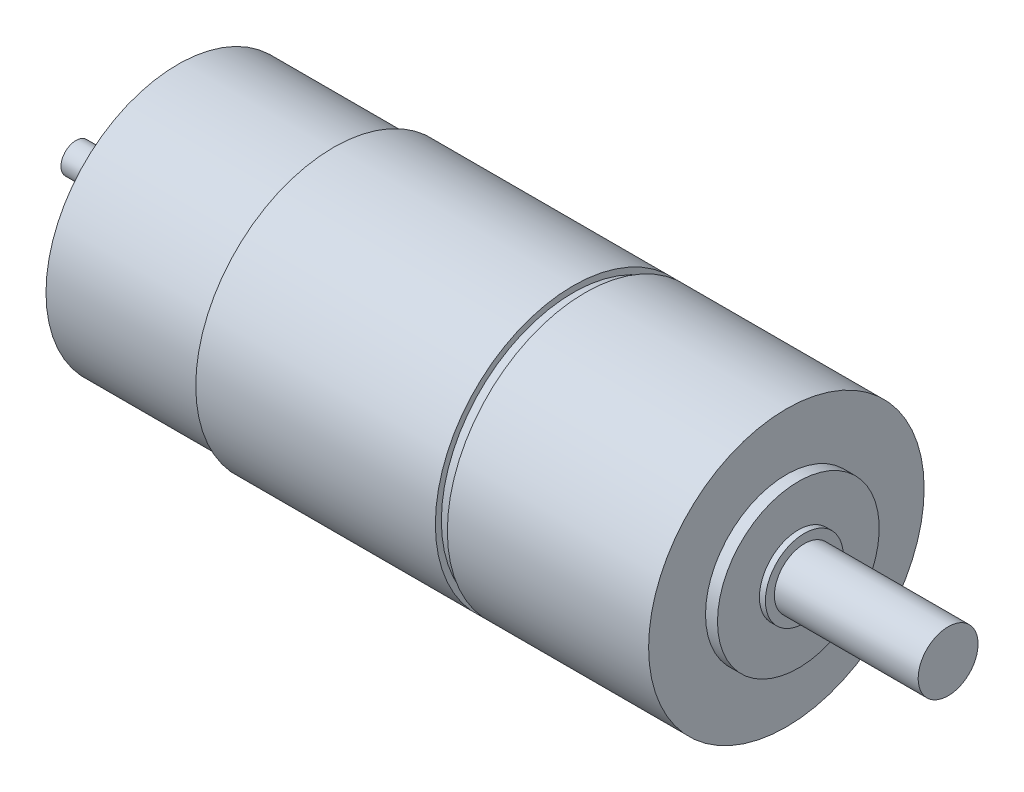
ISO-10303-21;
HEADER;
FILE_DESCRIPTION(('STEP AP214'),'2;1');
FILE_NAME('part.step','',(''),(''),'','','');
FILE_SCHEMA(('AUTOMOTIVE_DESIGN { 1 0 10303 214 1 1 1 1 }'));
ENDSEC;
DATA;
#1=APPLICATION_CONTEXT('core data for automotive mechanical design processes');
#2=APPLICATION_PROTOCOL_DEFINITION('international standard','automotive_design',2000,#1);
#3=PRODUCT_CONTEXT('',#1,'mechanical');
#4=PRODUCT('Part','Part','',(#3));
#5=PRODUCT_RELATED_PRODUCT_CATEGORY('part','',(#4));
#6=PRODUCT_DEFINITION_FORMATION('','',#4);
#7=PRODUCT_DEFINITION_CONTEXT('part definition',#1,'design');
#8=PRODUCT_DEFINITION('design','',#6,#7);
#9=PRODUCT_DEFINITION_SHAPE('','',#8);
#10=(LENGTH_UNIT() NAMED_UNIT(*) SI_UNIT(.MILLI.,.METRE.));
#11=(NAMED_UNIT(*) PLANE_ANGLE_UNIT() SI_UNIT($,.RADIAN.));
#12=(NAMED_UNIT(*) SI_UNIT($,.STERADIAN.) SOLID_ANGLE_UNIT());
#13=UNCERTAINTY_MEASURE_WITH_UNIT(LENGTH_MEASURE(1.E-05),#10,'distance_accuracy_value','');
#14=(GEOMETRIC_REPRESENTATION_CONTEXT(3) GLOBAL_UNCERTAINTY_ASSIGNED_CONTEXT((#13)) GLOBAL_UNIT_ASSIGNED_CONTEXT((#10,
#11,#12)) REPRESENTATION_CONTEXT('',''));
#15=CARTESIAN_POINT('',(0.,0.,0.));
#16=DIRECTION('',(0.,0.,1.));
#17=DIRECTION('',(1.,0.,0.));
#18=AXIS2_PLACEMENT_3D('',#15,#16,#17);
#19=CARTESIAN_POINT('',(145.6,0.,0.));
#20=DIRECTION('',(1.,0.,0.));
#21=DIRECTION('',(0.,0.,-1.));
#22=AXIS2_PLACEMENT_3D('',#19,#20,#21);
#23=PLANE('',#22);
#24=CARTESIAN_POINT('',(145.6,0.,0.));
#25=DIRECTION('',(-1.,0.,0.));
#26=DIRECTION('',(0.,0.,1.));
#27=AXIS2_PLACEMENT_3D('',#24,#25,#26);
#28=CIRCLE('',#27,5.);
#29=CARTESIAN_POINT('',(145.6,0.,5.));
#30=VERTEX_POINT('',#29);
#31=EDGE_CURVE('E49',#30,#30,#28,.T.);
#32=ORIENTED_EDGE('',*,*,#31,.F.);
#33=EDGE_LOOP('',(#32));
#34=FACE_BOUND('',#33,.T.);
#35=ADVANCED_FACE('F40',(#34),#23,.T.);
#36=CARTESIAN_POINT('',(0.,0.,0.));
#37=DIRECTION('',(-1.,0.,0.));
#38=DIRECTION('',(0.,0.,1.));
#39=AXIS2_PLACEMENT_3D('',#36,#37,#38);
#40=CYLINDRICAL_SURFACE('',#39,5.);
#41=ORIENTED_EDGE('',*,*,#31,.T.);
#42=EDGE_LOOP('',(#41));
#43=FACE_BOUND('',#42,.T.);
#44=CARTESIAN_POINT('',(121.6,0.,0.));
#45=DIRECTION('',(-1.,0.,0.));
#46=DIRECTION('',(0.,0.,1.));
#47=AXIS2_PLACEMENT_3D('',#44,#45,#46);
#48=CIRCLE('',#47,5.);
#49=CARTESIAN_POINT('',(121.6,0.,5.));
#50=VERTEX_POINT('',#49);
#51=EDGE_CURVE('E54',#50,#50,#48,.T.);
#52=ORIENTED_EDGE('',*,*,#51,.F.);
#53=EDGE_LOOP('',(#52));
#54=FACE_BOUND('',#53,.T.);
#55=ADVANCED_FACE('F348',(#43,#54),#40,.T.);
#56=CARTESIAN_POINT('',(121.6,0.,0.));
#57=DIRECTION('',(1.,0.,0.));
#58=DIRECTION('',(0.,0.,-1.));
#59=AXIS2_PLACEMENT_3D('',#56,#57,#58);
#60=PLANE('',#59);
#61=ORIENTED_EDGE('',*,*,#51,.T.);
#62=EDGE_LOOP('',(#61));
#63=FACE_BOUND('',#62,.T.);
#64=CARTESIAN_POINT('',(121.6,0.,0.));
#65=DIRECTION('',(-1.,0.,0.));
#66=DIRECTION('',(0.,0.,1.));
#67=AXIS2_PLACEMENT_3D('',#64,#65,#66);
#68=CIRCLE('',#67,6.5);
#69=CARTESIAN_POINT('',(121.6,0.,6.5));
#70=VERTEX_POINT('',#69);
#71=EDGE_CURVE('E59',#70,#70,#68,.T.);
#72=ORIENTED_EDGE('',*,*,#71,.F.);
#73=EDGE_LOOP('',(#72));
#74=FACE_BOUND('',#73,.T.);
#75=ADVANCED_FACE('F338',(#63,#74),#60,.T.);
#76=CARTESIAN_POINT('',(0.,0.,0.));
#77=DIRECTION('',(-1.,0.,0.));
#78=DIRECTION('',(0.,0.,1.));
#79=AXIS2_PLACEMENT_3D('',#76,#77,#78);
#80=CYLINDRICAL_SURFACE('',#79,6.5);
#81=ORIENTED_EDGE('',*,*,#71,.T.);
#82=EDGE_LOOP('',(#81));
#83=FACE_BOUND('',#82,.T.);
#84=CARTESIAN_POINT('',(120.6,0.,0.));
#85=DIRECTION('',(-1.,0.,0.));
#86=DIRECTION('',(0.,0.,1.));
#87=AXIS2_PLACEMENT_3D('',#84,#85,#86);
#88=CIRCLE('',#87,6.5);
#89=CARTESIAN_POINT('',(120.6,0.,6.5));
#90=VERTEX_POINT('',#89);
#91=EDGE_CURVE('E65',#90,#90,#88,.T.);
#92=ORIENTED_EDGE('',*,*,#91,.F.);
#93=EDGE_LOOP('',(#92));
#94=FACE_BOUND('',#93,.T.);
#95=ADVANCED_FACE('F328',(#83,#94),#80,.T.);
#96=CARTESIAN_POINT('',(120.6,0.,0.));
#97=DIRECTION('',(1.,0.,0.));
#98=DIRECTION('',(0.,0.,-1.));
#99=AXIS2_PLACEMENT_3D('',#96,#97,#98);
#100=PLANE('',#99);
#101=ORIENTED_EDGE('',*,*,#91,.T.);
#102=EDGE_LOOP('',(#101));
#103=FACE_BOUND('',#102,.T.);
#104=CARTESIAN_POINT('',(120.6,0.,0.));
#105=DIRECTION('',(-1.,0.,0.));
#106=DIRECTION('',(0.,0.,1.));
#107=AXIS2_PLACEMENT_3D('',#104,#105,#106);
#108=CIRCLE('',#107,13.5);
#109=CARTESIAN_POINT('',(120.6,0.,13.5));
#110=VERTEX_POINT('',#109);
#111=EDGE_CURVE('E69',#110,#110,#108,.T.);
#112=ORIENTED_EDGE('',*,*,#111,.F.);
#113=EDGE_LOOP('',(#112));
#114=FACE_BOUND('',#113,.T.);
#115=ADVANCED_FACE('F318',(#103,#114),#100,.T.);
#116=CARTESIAN_POINT('',(0.,0.,0.));
#117=DIRECTION('',(-1.,0.,0.));
#118=DIRECTION('',(0.,0.,1.));
#119=AXIS2_PLACEMENT_3D('',#116,#117,#118);
#120=CYLINDRICAL_SURFACE('',#119,13.5);
#121=ORIENTED_EDGE('',*,*,#111,.T.);
#122=EDGE_LOOP('',(#121));
#123=FACE_BOUND('',#122,.T.);
#124=CARTESIAN_POINT('',(118.6,0.,0.));
#125=DIRECTION('',(-1.,0.,0.));
#126=DIRECTION('',(0.,0.,1.));
#127=AXIS2_PLACEMENT_3D('',#124,#125,#126);
#128=CIRCLE('',#127,13.5);
#129=CARTESIAN_POINT('',(118.6,0.,13.5));
#130=VERTEX_POINT('',#129);
#131=EDGE_CURVE('E73',#130,#130,#128,.T.);
#132=ORIENTED_EDGE('',*,*,#131,.F.);
#133=EDGE_LOOP('',(#132));
#134=FACE_BOUND('',#133,.T.);
#135=ADVANCED_FACE('F308',(#123,#134),#120,.T.);
#136=CARTESIAN_POINT('',(118.6,0.,0.));
#137=DIRECTION('',(1.,0.,0.));
#138=DIRECTION('',(0.,0.,-1.));
#139=AXIS2_PLACEMENT_3D('',#136,#137,#138);
#140=PLANE('',#139);
#141=ORIENTED_EDGE('',*,*,#131,.T.);
#142=EDGE_LOOP('',(#141));
#143=FACE_BOUND('',#142,.T.);
#144=CARTESIAN_POINT('',(118.6,0.,0.));
#145=DIRECTION('',(-1.,0.,0.));
#146=DIRECTION('',(0.,0.,1.));
#147=AXIS2_PLACEMENT_3D('',#144,#145,#146);
#148=CIRCLE('',#147,23.);
#149=CARTESIAN_POINT('',(118.6,0.,23.));
#150=VERTEX_POINT('',#149);
#151=EDGE_CURVE('E77',#150,#150,#148,.T.);
#152=ORIENTED_EDGE('',*,*,#151,.F.);
#153=EDGE_LOOP('',(#152));
#154=FACE_BOUND('',#153,.T.);
#155=ADVANCED_FACE('F298',(#143,#154),#140,.T.);
#156=CARTESIAN_POINT('',(0.,0.,0.));
#157=DIRECTION('',(-1.,0.,0.));
#158=DIRECTION('',(0.,0.,1.));
#159=AXIS2_PLACEMENT_3D('',#156,#157,#158);
#160=CYLINDRICAL_SURFACE('',#159,23.);
#161=ORIENTED_EDGE('',*,*,#151,.T.);
#162=EDGE_LOOP('',(#161));
#163=FACE_BOUND('',#162,.T.);
#164=CARTESIAN_POINT('',(85.,0.,0.));
#165=DIRECTION('',(-1.,0.,0.));
#166=DIRECTION('',(0.,0.,1.));
#167=AXIS2_PLACEMENT_3D('',#164,#165,#166);
#168=CIRCLE('',#167,23.);
#169=CARTESIAN_POINT('',(85.,0.,23.));
#170=VERTEX_POINT('',#169);
#171=EDGE_CURVE('E81',#170,#170,#168,.T.);
#172=ORIENTED_EDGE('',*,*,#171,.F.);
#173=EDGE_LOOP('',(#172));
#174=FACE_BOUND('',#173,.T.);
#175=ADVANCED_FACE('F288',(#163,#174),#160,.T.);
#176=CARTESIAN_POINT('',(85.,0.,0.));
#177=DIRECTION('',(1.,0.,0.));
#178=DIRECTION('',(0.,0.,-1.));
#179=AXIS2_PLACEMENT_3D('',#176,#177,#178);
#180=PLANE('',#179);
#181=CARTESIAN_POINT('',(85.,0.,0.));
#182=DIRECTION('',(-1.,0.,0.));
#183=DIRECTION('',(0.,0.,1.));
#184=AXIS2_PLACEMENT_3D('',#181,#182,#183);
#185=CIRCLE('',#184,22.);
#186=CARTESIAN_POINT('',(85.,0.,22.));
#187=VERTEX_POINT('',#186);
#188=EDGE_CURVE('E85',#187,#187,#185,.T.);
#189=ORIENTED_EDGE('',*,*,#188,.F.);
#190=EDGE_LOOP('',(#189));
#191=FACE_BOUND('',#190,.T.);
#192=ORIENTED_EDGE('',*,*,#171,.T.);
#193=EDGE_LOOP('',(#192));
#194=FACE_BOUND('',#193,.T.);
#195=ADVANCED_FACE('F278',(#191,#194),#180,.F.);
#196=CARTESIAN_POINT('',(0.,0.,0.));
#197=DIRECTION('',(-1.,0.,0.));
#198=DIRECTION('',(0.,0.,1.));
#199=AXIS2_PLACEMENT_3D('',#196,#197,#198);
#200=CYLINDRICAL_SURFACE('',#199,22.);
#201=ORIENTED_EDGE('',*,*,#188,.T.);
#202=EDGE_LOOP('',(#201));
#203=FACE_BOUND('',#202,.T.);
#204=CARTESIAN_POINT('',(83.,0.,0.));
#205=DIRECTION('',(-1.,0.,0.));
#206=DIRECTION('',(0.,0.,1.));
#207=AXIS2_PLACEMENT_3D('',#204,#205,#206);
#208=CIRCLE('',#207,22.);
#209=CARTESIAN_POINT('',(83.,0.,22.));
#210=VERTEX_POINT('',#209);
#211=EDGE_CURVE('E89',#210,#210,#208,.T.);
#212=ORIENTED_EDGE('',*,*,#211,.F.);
#213=EDGE_LOOP('',(#212));
#214=FACE_BOUND('',#213,.T.);
#215=ADVANCED_FACE('F268',(#203,#214),#200,.T.);
#216=CARTESIAN_POINT('',(83.,0.,0.));
#217=DIRECTION('',(1.,0.,0.));
#218=DIRECTION('',(0.,0.,-1.));
#219=AXIS2_PLACEMENT_3D('',#216,#217,#218);
#220=PLANE('',#219);
#221=ORIENTED_EDGE('',*,*,#211,.T.);
#222=EDGE_LOOP('',(#221));
#223=FACE_BOUND('',#222,.T.);
#224=CARTESIAN_POINT('',(83.,0.,0.));
#225=DIRECTION('',(-1.,0.,0.));
#226=DIRECTION('',(0.,0.,1.));
#227=AXIS2_PLACEMENT_3D('',#224,#225,#226);
#228=CIRCLE('',#227,23.);
#229=CARTESIAN_POINT('',(83.,0.,23.));
#230=VERTEX_POINT('',#229);
#231=EDGE_CURVE('E93',#230,#230,#228,.T.);
#232=ORIENTED_EDGE('',*,*,#231,.F.);
#233=EDGE_LOOP('',(#232));
#234=FACE_BOUND('',#233,.T.);
#235=ADVANCED_FACE('F258',(#223,#234),#220,.T.);
#236=CARTESIAN_POINT('',(0.,0.,0.));
#237=DIRECTION('',(-1.,0.,0.));
#238=DIRECTION('',(0.,0.,1.));
#239=AXIS2_PLACEMENT_3D('',#236,#237,#238);
#240=CYLINDRICAL_SURFACE('',#239,23.);
#241=ORIENTED_EDGE('',*,*,#231,.T.);
#242=EDGE_LOOP('',(#241));
#243=FACE_BOUND('',#242,.T.);
#244=CARTESIAN_POINT('',(43.,0.,0.));
#245=DIRECTION('',(-1.,0.,0.));
#246=DIRECTION('',(0.,0.,1.));
#247=AXIS2_PLACEMENT_3D('',#244,#245,#246);
#248=CIRCLE('',#247,23.);
#249=CARTESIAN_POINT('',(43.,0.,23.));
#250=VERTEX_POINT('',#249);
#251=EDGE_CURVE('E97',#250,#250,#248,.T.);
#252=ORIENTED_EDGE('',*,*,#251,.F.);
#253=EDGE_LOOP('',(#252));
#254=FACE_BOUND('',#253,.T.);
#255=ADVANCED_FACE('F248',(#243,#254),#240,.T.);
#256=CARTESIAN_POINT('',(43.,0.,0.));
#257=DIRECTION('',(-1.,0.,0.));
#258=DIRECTION('',(0.,0.,1.));
#259=AXIS2_PLACEMENT_3D('',#256,#257,#258);
#260=PLANE('',#259);
#261=ORIENTED_EDGE('',*,*,#251,.T.);
#262=EDGE_LOOP('',(#261));
#263=FACE_BOUND('',#262,.T.);
#264=CARTESIAN_POINT('',(43.,0.,0.));
#265=DIRECTION('',(-1.,0.,0.));
#266=DIRECTION('',(0.,0.,1.));
#267=AXIS2_PLACEMENT_3D('',#264,#265,#266);
#268=CIRCLE('',#267,22.);
#269=CARTESIAN_POINT('',(43.,0.,22.));
#270=VERTEX_POINT('',#269);
#271=EDGE_CURVE('E101',#270,#270,#268,.T.);
#272=ORIENTED_EDGE('',*,*,#271,.F.);
#273=EDGE_LOOP('',(#272));
#274=FACE_BOUND('',#273,.T.);
#275=ADVANCED_FACE('F236',(#263,#274),#260,.T.);
#276=CARTESIAN_POINT('',(0.,0.,0.));
#277=DIRECTION('',(-1.,0.,0.));
#278=DIRECTION('',(0.,0.,1.));
#279=AXIS2_PLACEMENT_3D('',#276,#277,#278);
#280=CYLINDRICAL_SURFACE('',#279,22.);
#281=ORIENTED_EDGE('',*,*,#271,.T.);
#282=EDGE_LOOP('',(#281));
#283=FACE_BOUND('',#282,.T.);
#284=CARTESIAN_POINT('',(17.,0.,0.));
#285=DIRECTION('',(-1.,0.,0.));
#286=DIRECTION('',(0.,0.,1.));
#287=AXIS2_PLACEMENT_3D('',#284,#285,#286);
#288=CIRCLE('',#287,22.);
#289=CARTESIAN_POINT('',(17.,0.,22.));
#290=VERTEX_POINT('',#289);
#291=EDGE_CURVE('E105',#290,#290,#288,.T.);
#292=ORIENTED_EDGE('',*,*,#291,.F.);
#293=EDGE_LOOP('',(#292));
#294=FACE_BOUND('',#293,.T.);
#295=ADVANCED_FACE('F227',(#283,#294),#280,.T.);
#296=CARTESIAN_POINT('',(17.,0.,0.));
#297=DIRECTION('',(-1.,0.,0.));
#298=DIRECTION('',(0.,0.,1.));
#299=AXIS2_PLACEMENT_3D('',#296,#297,#298);
#300=PLANE('',#299);
#301=ORIENTED_EDGE('',*,*,#291,.T.);
#302=EDGE_LOOP('',(#301));
#303=FACE_BOUND('',#302,.T.);
#304=CARTESIAN_POINT('',(17.,0.,0.));
#305=DIRECTION('',(-1.,0.,0.));
#306=DIRECTION('',(0.,0.,1.));
#307=AXIS2_PLACEMENT_3D('',#304,#305,#306);
#308=CIRCLE('',#307,6.);
#309=CARTESIAN_POINT('',(17.,0.,6.));
#310=VERTEX_POINT('',#309);
#311=EDGE_CURVE('E109',#310,#310,#308,.T.);
#312=ORIENTED_EDGE('',*,*,#311,.F.);
#313=EDGE_LOOP('',(#312));
#314=FACE_BOUND('',#313,.T.);
#315=ADVANCED_FACE('F218',(#303,#314),#300,.T.);
#316=CARTESIAN_POINT('',(0.,0.,0.));
#317=DIRECTION('',(-1.,0.,0.));
#318=DIRECTION('',(0.,0.,1.));
#319=AXIS2_PLACEMENT_3D('',#316,#317,#318);
#320=CYLINDRICAL_SURFACE('',#319,6.);
#321=ORIENTED_EDGE('',*,*,#311,.T.);
#322=EDGE_LOOP('',(#321));
#323=FACE_BOUND('',#322,.T.);
#324=CARTESIAN_POINT('',(12.,0.,0.));
#325=DIRECTION('',(-1.,0.,0.));
#326=DIRECTION('',(0.,0.,1.));
#327=AXIS2_PLACEMENT_3D('',#324,#325,#326);
#328=CIRCLE('',#327,6.);
#329=CARTESIAN_POINT('',(12.,0.,6.));
#330=VERTEX_POINT('',#329);
#331=EDGE_CURVE('E113',#330,#330,#328,.T.);
#332=ORIENTED_EDGE('',*,*,#331,.F.);
#333=EDGE_LOOP('',(#332));
#334=FACE_BOUND('',#333,.T.);
#335=ADVANCED_FACE('F209',(#323,#334),#320,.T.);
#336=CARTESIAN_POINT('',(12.,0.,0.));
#337=DIRECTION('',(-1.,0.,0.));
#338=DIRECTION('',(0.,0.,1.));
#339=AXIS2_PLACEMENT_3D('',#336,#337,#338);
#340=PLANE('',#339);
#341=ORIENTED_EDGE('',*,*,#331,.T.);
#342=EDGE_LOOP('',(#341));
#343=FACE_BOUND('',#342,.T.);
#344=CARTESIAN_POINT('',(12.,0.,0.));
#345=DIRECTION('',(-1.,0.,0.));
#346=DIRECTION('',(0.,0.,1.));
#347=AXIS2_PLACEMENT_3D('',#344,#345,#346);
#348=CIRCLE('',#347,5.);
#349=CARTESIAN_POINT('',(12.,0.,5.));
#350=VERTEX_POINT('',#349);
#351=EDGE_CURVE('E117',#350,#350,#348,.T.);
#352=ORIENTED_EDGE('',*,*,#351,.F.);
#353=EDGE_LOOP('',(#352));
#354=FACE_BOUND('',#353,.T.);
#355=ADVANCED_FACE('F200',(#343,#354),#340,.T.);
#356=CARTESIAN_POINT('',(0.,0.,0.));
#357=DIRECTION('',(-1.,0.,0.));
#358=DIRECTION('',(0.,0.,1.));
#359=AXIS2_PLACEMENT_3D('',#356,#357,#358);
#360=CYLINDRICAL_SURFACE('',#359,5.);
#361=ORIENTED_EDGE('',*,*,#351,.T.);
#362=EDGE_LOOP('',(#361));
#363=FACE_BOUND('',#362,.T.);
#364=CARTESIAN_POINT('',(10.,0.,0.));
#365=DIRECTION('',(-1.,0.,0.));
#366=DIRECTION('',(0.,0.,1.));
#367=AXIS2_PLACEMENT_3D('',#364,#365,#366);
#368=CIRCLE('',#367,5.);
#369=CARTESIAN_POINT('',(10.,0.,5.));
#370=VERTEX_POINT('',#369);
#371=EDGE_CURVE('E121',#370,#370,#368,.T.);
#372=ORIENTED_EDGE('',*,*,#371,.F.);
#373=EDGE_LOOP('',(#372));
#374=FACE_BOUND('',#373,.T.);
#375=ADVANCED_FACE('F191',(#363,#374),#360,.T.);
#376=CARTESIAN_POINT('',(10.,0.,0.));
#377=DIRECTION('',(-1.,0.,0.));
#378=DIRECTION('',(0.,0.,1.));
#379=AXIS2_PLACEMENT_3D('',#376,#377,#378);
#380=PLANE('',#379);
#381=ORIENTED_EDGE('',*,*,#371,.T.);
#382=EDGE_LOOP('',(#381));
#383=FACE_BOUND('',#382,.T.);
#384=CARTESIAN_POINT('',(10.,0.,0.));
#385=DIRECTION('',(-1.,0.,0.));
#386=DIRECTION('',(0.,0.,1.));
#387=AXIS2_PLACEMENT_3D('',#384,#385,#386);
#388=CIRCLE('',#387,2.5);
#389=CARTESIAN_POINT('',(10.,0.,2.5));
#390=VERTEX_POINT('',#389);
#391=EDGE_CURVE('E125',#390,#390,#388,.T.);
#392=ORIENTED_EDGE('',*,*,#391,.F.);
#393=EDGE_LOOP('',(#392));
#394=FACE_BOUND('',#393,.T.);
#395=ADVANCED_FACE('F182',(#383,#394),#380,.T.);
#396=CARTESIAN_POINT('',(0.,0.,0.));
#397=DIRECTION('',(-1.,0.,0.));
#398=DIRECTION('',(0.,0.,1.));
#399=AXIS2_PLACEMENT_3D('',#396,#397,#398);
#400=CYLINDRICAL_SURFACE('',#399,2.5);
#401=ORIENTED_EDGE('',*,*,#391,.T.);
#402=EDGE_LOOP('',(#401));
#403=FACE_BOUND('',#402,.T.);
#404=CARTESIAN_POINT('',(0.,0.,0.));
#405=DIRECTION('',(-1.,0.,0.));
#406=DIRECTION('',(0.,0.,1.));
#407=AXIS2_PLACEMENT_3D('',#404,#405,#406);
#408=CIRCLE('',#407,2.5);
#409=CARTESIAN_POINT('',(0.,0.,2.5));
#410=VERTEX_POINT('',#409);
#411=EDGE_CURVE('E129',#410,#410,#408,.T.);
#412=ORIENTED_EDGE('',*,*,#411,.F.);
#413=EDGE_LOOP('',(#412));
#414=FACE_BOUND('',#413,.T.);
#415=ADVANCED_FACE('F175',(#403,#414),#400,.T.);
#416=CARTESIAN_POINT('',(0.,0.,0.));
#417=DIRECTION('',(-1.,0.,0.));
#418=DIRECTION('',(0.,0.,1.));
#419=AXIS2_PLACEMENT_3D('',#416,#417,#418);
#420=PLANE('',#419);
#421=ORIENTED_EDGE('',*,*,#411,.T.);
#422=EDGE_LOOP('',(#421));
#423=FACE_BOUND('',#422,.T.);
#424=ADVANCED_FACE('F157',(#423),#420,.T.);
#425=CLOSED_SHELL('',(#35,#55,#75,#95,#115,#135,#155,#175,#195,#215,#235,#255,#275,#295,#315,
#335,#355,#375,#395,#415,#424));
#426=CARTESIAN_POINT('',(0.,0.,0.));
#427=DIRECTION('',(-1.,0.,0.));
#428=DIRECTION('',(0.,0.,1.));
#429=AXIS2_PLACEMENT_3D('',#426,#427,#428);
#430=CYLINDRICAL_SURFACE('',#429,20.);
#431=CARTESIAN_POINT('',(116.6,0.,0.));
#432=DIRECTION('',(-1.,0.,0.));
#433=DIRECTION('',(0.,0.,1.));
#434=AXIS2_PLACEMENT_3D('',#431,#432,#433);
#435=CIRCLE('',#434,20.);
#436=CARTESIAN_POINT('',(116.6,0.,20.));
#437=VERTEX_POINT('',#436);
#438=EDGE_CURVE('E10',#437,#437,#435,.T.);
#439=ORIENTED_EDGE('',*,*,#438,.F.);
#440=EDGE_LOOP('',(#439));
#441=FACE_BOUND('',#440,.T.);
#442=CARTESIAN_POINT('',(19.,0.,0.));
#443=DIRECTION('',(-1.,0.,0.));
#444=DIRECTION('',(0.,0.,1.));
#445=AXIS2_PLACEMENT_3D('',#442,#443,#444);
#446=CIRCLE('',#445,20.);
#447=CARTESIAN_POINT('',(19.,0.,20.));
#448=VERTEX_POINT('',#447);
#449=EDGE_CURVE('E133',#448,#448,#446,.T.);
#450=ORIENTED_EDGE('',*,*,#449,.T.);
#451=EDGE_LOOP('',(#450));
#452=FACE_BOUND('',#451,.T.);
#453=ADVANCED_FACE('F42',(#441,#452),#430,.F.);
#454=CARTESIAN_POINT('',(116.6,0.,0.));
#455=DIRECTION('',(1.,0.,0.));
#456=DIRECTION('',(0.,0.,-1.));
#457=AXIS2_PLACEMENT_3D('',#454,#455,#456);
#458=PLANE('',#457);
#459=ORIENTED_EDGE('',*,*,#438,.T.);
#460=EDGE_LOOP('',(#459));
#461=FACE_BOUND('',#460,.T.);
#462=ADVANCED_FACE('F141',(#461),#458,.F.);
#463=CARTESIAN_POINT('',(19.,0.,0.));
#464=DIRECTION('',(1.,0.,0.));
#465=DIRECTION('',(0.,0.,-1.));
#466=AXIS2_PLACEMENT_3D('',#463,#464,#465);
#467=PLANE('',#466);
#468=ORIENTED_EDGE('',*,*,#449,.F.);
#469=EDGE_LOOP('',(#468));
#470=FACE_BOUND('',#469,.T.);
#471=ADVANCED_FACE('F139',(#470),#467,.T.);
#472=CLOSED_SHELL('',(#453,#462,#471));
#473=ORIENTED_CLOSED_SHELL('',*,#472,.T.);
#474=BREP_WITH_VOIDS('B2',#425,(#473));
#475=ADVANCED_BREP_SHAPE_REPRESENTATION('',(#18,#474),#14);
#476=SHAPE_DEFINITION_REPRESENTATION(#9,#475);
ENDSEC;
END-ISO-10303-21;
